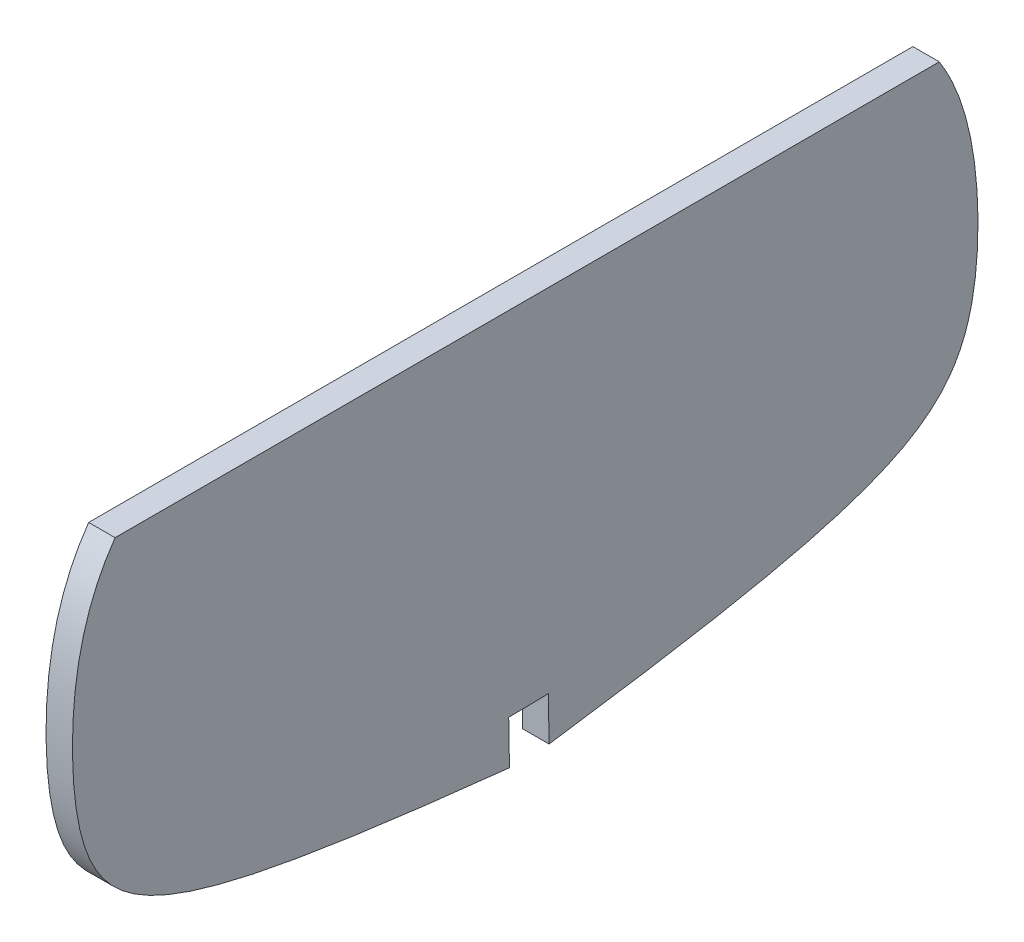
ISO-10303-21;
HEADER;
FILE_DESCRIPTION(('STEP AP214'),'2;1');
FILE_NAME('part.step','',(''),(''),'','','');
FILE_SCHEMA(('AUTOMOTIVE_DESIGN { 1 0 10303 214 1 1 1 1 }'));
ENDSEC;
DATA;
#1=APPLICATION_CONTEXT('core data for automotive mechanical design processes');
#2=APPLICATION_PROTOCOL_DEFINITION('international standard','automotive_design',2000,#1);
#3=PRODUCT_CONTEXT('',#1,'mechanical');
#4=PRODUCT('Part','Part','',(#3));
#5=PRODUCT_RELATED_PRODUCT_CATEGORY('part','',(#4));
#6=PRODUCT_DEFINITION_FORMATION('','',#4);
#7=PRODUCT_DEFINITION_CONTEXT('part definition',#1,'design');
#8=PRODUCT_DEFINITION('design','',#6,#7);
#9=PRODUCT_DEFINITION_SHAPE('','',#8);
#10=(LENGTH_UNIT() NAMED_UNIT(*) SI_UNIT(.MILLI.,.METRE.));
#11=(NAMED_UNIT(*) PLANE_ANGLE_UNIT() SI_UNIT($,.RADIAN.));
#12=(NAMED_UNIT(*) SI_UNIT($,.STERADIAN.) SOLID_ANGLE_UNIT());
#13=UNCERTAINTY_MEASURE_WITH_UNIT(LENGTH_MEASURE(1.E-05),#10,'distance_accuracy_value','');
#14=(GEOMETRIC_REPRESENTATION_CONTEXT(3) GLOBAL_UNCERTAINTY_ASSIGNED_CONTEXT((#13)) GLOBAL_UNIT_ASSIGNED_CONTEXT((#10,
#11,#12)) REPRESENTATION_CONTEXT('',''));
#15=CARTESIAN_POINT('',(0.,0.,0.));
#16=DIRECTION('',(0.,0.,1.));
#17=DIRECTION('',(1.,0.,0.));
#18=AXIS2_PLACEMENT_3D('',#15,#16,#17);
#19=CARTESIAN_POINT('',(6.,289.002460422602,4.98309979340308));
#20=CARTESIAN_POINT('',(6.,312.815060008237,-165.372196707226));
#21=CARTESIAN_POINT('',(6.,313.398260751005,-37.5129726486712));
#22=CARTESIAN_POINT('',(6.,409.320091083024,-169.034448931547));
#23=CARTESIAN_POINT('',(6.,409.751237326818,7.06510007937025));
#24=B_SPLINE_CURVE_WITH_KNOTS('',4,(#19,#20,#21,#22,#23),.UNSPECIFIED.,.F.,.F.,(5,5),(0.,1.),.UNSPECIFIED.);
#25=DIRECTION('',(-1.,0.,0.));
#26=VECTOR('',#25,1.);
#27=SURFACE_OF_LINEAR_EXTRUSION('',#24,#26);
#28=CARTESIAN_POINT('',(0.,289.002460422602,4.98309979340308));
#29=CARTESIAN_POINT('',(0.,312.815060008237,-165.372196707226));
#30=CARTESIAN_POINT('',(0.,313.398260751005,-37.5129726486712));
#31=CARTESIAN_POINT('',(0.,409.320091083024,-169.034448931547));
#32=CARTESIAN_POINT('',(0.,409.751237326818,7.06510007937025));
#33=B_SPLINE_CURVE_WITH_KNOTS('',4,(#28,#29,#30,#31,#32),.UNSPECIFIED.,.F.,.F.,(5,5),(0.,1.),.UNSPECIFIED.);
#34=CARTESIAN_POINT('',(0.,289.635171211587,0.492671400530014));
#35=VERTEX_POINT('',#34);
#36=CARTESIAN_POINT('',(0.,379.522870514622,-88.1370104605886));
#37=VERTEX_POINT('',#36);
#38=EDGE_CURVE('E114',#35,#37,#33,.T.);
#39=ORIENTED_EDGE('',*,*,#38,.T.);
#40=DIRECTION('',(-1.,0.,0.));
#41=VECTOR('',#40,1.);
#42=CARTESIAN_POINT('',(6.,379.522870513728,-88.1370104611526));
#43=LINE('',#42,#41);
#44=CARTESIAN_POINT('',(6.,379.522870513728,-88.1370104605886));
#45=VERTEX_POINT('',#44);
#46=EDGE_CURVE('E48',#37,#45,#43,.F.);
#47=ORIENTED_EDGE('',*,*,#46,.T.);
#48=CARTESIAN_POINT('',(6.,289.635171211587,0.492671400530014));
#49=VERTEX_POINT('',#48);
#50=EDGE_CURVE('E98',#49,#45,#24,.T.);
#51=ORIENTED_EDGE('',*,*,#50,.F.);
#52=DIRECTION('',(1.,0.,0.));
#53=VECTOR('',#52,1.);
#54=CARTESIAN_POINT('',(0.,289.635171211587,0.492671400530014));
#55=LINE('',#54,#53);
#56=EDGE_CURVE('E149',#35,#49,#55,.T.);
#57=ORIENTED_EDGE('',*,*,#56,.F.);
#58=EDGE_LOOP('',(#39,#47,#51,#57));
#59=FACE_BOUND('',#58,.T.);
#60=ADVANCED_FACE('F33',(#59),#27,.F.);
#61=CARTESIAN_POINT('',(6.,409.751237326818,7.06510007937025));
#62=CARTESIAN_POINT('',(6.,403.249389945732,183.045107550575));
#63=CARTESIAN_POINT('',(6.,311.918725168243,48.2949464034591));
#64=CARTESIAN_POINT('',(6.,306.92797845909,176.058062157761));
#65=CARTESIAN_POINT('',(6.,289.002460422602,4.98309979340308));
#66=B_SPLINE_CURVE_WITH_KNOTS('',4,(#61,#62,#63,#64,#65),.UNSPECIFIED.,.F.,.F.,(5,5),(0.,1.),.UNSPECIFIED.);
#67=DIRECTION('',(-1.,0.,0.));
#68=VECTOR('',#67,1.);
#69=SURFACE_OF_LINEAR_EXTRUSION('',#66,#68);
#70=CARTESIAN_POINT('',(6.,379.522870513728,99.0686347015067));
#71=VERTEX_POINT('',#70);
#72=CARTESIAN_POINT('',(6.,289.479989494189,9.49267140053002));
#73=VERTEX_POINT('',#72);
#74=EDGE_CURVE('E41',#71,#73,#66,.T.);
#75=ORIENTED_EDGE('',*,*,#74,.F.);
#76=DIRECTION('',(-1.,0.,0.));
#77=VECTOR('',#76,1.);
#78=CARTESIAN_POINT('',(6.,379.522870513728,99.0686347017889));
#79=LINE('',#78,#77);
#80=CARTESIAN_POINT('',(0.,379.522870513728,99.0686347015067));
#81=VERTEX_POINT('',#80);
#82=EDGE_CURVE('E83',#71,#81,#79,.T.);
#83=ORIENTED_EDGE('',*,*,#82,.T.);
#84=CARTESIAN_POINT('',(0.,409.751237326818,7.06510007937025));
#85=CARTESIAN_POINT('',(0.,403.249389945732,183.045107550575));
#86=CARTESIAN_POINT('',(0.,311.918725168243,48.2949464034591));
#87=CARTESIAN_POINT('',(0.,306.92797845909,176.058062157761));
#88=CARTESIAN_POINT('',(0.,289.002460422602,4.98309979340308));
#89=B_SPLINE_CURVE_WITH_KNOTS('',4,(#84,#85,#86,#87,#88),.UNSPECIFIED.,.F.,.F.,(5,5),(0.,1.),.UNSPECIFIED.);
#90=CARTESIAN_POINT('',(0.,289.479989494189,9.49267140053002));
#91=VERTEX_POINT('',#90);
#92=EDGE_CURVE('E105',#81,#91,#89,.T.);
#93=ORIENTED_EDGE('',*,*,#92,.T.);
#94=DIRECTION('',(1.,0.,0.));
#95=VECTOR('',#94,1.);
#96=CARTESIAN_POINT('',(0.,289.479989494189,9.49267140053002));
#97=LINE('',#96,#95);
#98=EDGE_CURVE('E103',#91,#73,#97,.T.);
#99=ORIENTED_EDGE('',*,*,#98,.T.);
#100=EDGE_LOOP('',(#75,#83,#93,#99));
#101=FACE_BOUND('',#100,.T.);
#102=ADVANCED_FACE('F101',(#101),#69,.F.);
#103=CARTESIAN_POINT('',(6.,341.730241663781,-96.9160136608967));
#104=DIRECTION('',(1.,0.,0.));
#105=DIRECTION('',(0.,0.,-1.));
#106=AXIS2_PLACEMENT_3D('',#103,#104,#105);
#107=PLANE('',#106);
#108=DIRECTION('',(0.,0.,-1.));
#109=VECTOR('',#108,1.);
#110=CARTESIAN_POINT('',(6.,379.522870513728,108.247582595054));
#111=LINE('',#110,#109);
#112=EDGE_CURVE('E86',#71,#45,#111,.T.);
#113=ORIENTED_EDGE('',*,*,#112,.F.);
#114=ORIENTED_EDGE('',*,*,#74,.T.);
#115=DIRECTION('',(0.,-0.99985138273341,-0.017239850523927));
#116=VECTOR('',#115,1.);
#117=CARTESIAN_POINT('',(6.,289.479989494189,9.49267140053002));
#118=LINE('',#117,#116);
#119=CARTESIAN_POINT('',(6.,299.479989494189,9.66509553097225));
#120=VERTEX_POINT('',#119);
#121=EDGE_CURVE('E156',#120,#73,#118,.T.);
#122=ORIENTED_EDGE('',*,*,#121,.F.);
#123=DIRECTION('',(0.,-0.0172398505239238,0.99985138273341));
#124=VECTOR('',#123,1.);
#125=CARTESIAN_POINT('',(6.,299.479989494189,9.66509553097225));
#126=LINE('',#125,#124);
#127=CARTESIAN_POINT('',(6.,299.635171211587,0.665095530972245));
#128=VERTEX_POINT('',#127);
#129=EDGE_CURVE('E169',#128,#120,#126,.T.);
#130=ORIENTED_EDGE('',*,*,#129,.F.);
#131=DIRECTION('',(0.,0.99985138273341,0.0172398505239271));
#132=VECTOR('',#131,1.);
#133=CARTESIAN_POINT('',(6.,299.635171211587,0.665095530972245));
#134=LINE('',#133,#132);
#135=EDGE_CURVE('E168',#49,#128,#134,.T.);
#136=ORIENTED_EDGE('',*,*,#135,.F.);
#137=ORIENTED_EDGE('',*,*,#50,.T.);
#138=EDGE_LOOP('',(#113,#114,#122,#130,#136,#137));
#139=FACE_BOUND('',#138,.T.);
#140=ADVANCED_FACE('F93',(#139),#107,.T.);
#141=CARTESIAN_POINT('',(0.,341.730241663781,-96.9160136608967));
#142=DIRECTION('',(1.,0.,0.));
#143=DIRECTION('',(0.,0.,-1.));
#144=AXIS2_PLACEMENT_3D('',#141,#142,#143);
#145=PLANE('',#144);
#146=ORIENTED_EDGE('',*,*,#92,.F.);
#147=DIRECTION('',(0.,0.,-1.));
#148=VECTOR('',#147,1.);
#149=CARTESIAN_POINT('',(0.,379.522870513728,-96.9160136608967));
#150=LINE('',#149,#148);
#151=EDGE_CURVE('E11',#81,#37,#150,.T.);
#152=ORIENTED_EDGE('',*,*,#151,.T.);
#153=ORIENTED_EDGE('',*,*,#38,.F.);
#154=DIRECTION('',(0.,0.99985138273341,0.0172398505239271));
#155=VECTOR('',#154,1.);
#156=CARTESIAN_POINT('',(0.,299.635171211587,0.665095530972245));
#157=LINE('',#156,#155);
#158=CARTESIAN_POINT('',(0.,299.635171211587,0.665095530972241));
#159=VERTEX_POINT('',#158);
#160=EDGE_CURVE('E164',#35,#159,#157,.T.);
#161=ORIENTED_EDGE('',*,*,#160,.T.);
#162=DIRECTION('',(0.,-0.0172398505239238,0.99985138273341));
#163=VECTOR('',#162,1.);
#164=CARTESIAN_POINT('',(0.,299.479989494189,9.66509553097225));
#165=LINE('',#164,#163);
#166=CARTESIAN_POINT('',(0.,299.479989494189,9.66509553097225));
#167=VERTEX_POINT('',#166);
#168=EDGE_CURVE('E55',#159,#167,#165,.T.);
#169=ORIENTED_EDGE('',*,*,#168,.T.);
#170=DIRECTION('',(0.,-0.99985138273341,-0.017239850523927));
#171=VECTOR('',#170,1.);
#172=CARTESIAN_POINT('',(0.,289.479989494189,9.49267140053002));
#173=LINE('',#172,#171);
#174=EDGE_CURVE('E159',#167,#91,#173,.T.);
#175=ORIENTED_EDGE('',*,*,#174,.T.);
#176=EDGE_LOOP('',(#146,#152,#153,#161,#169,#175));
#177=FACE_BOUND('',#176,.T.);
#178=ADVANCED_FACE('F122',(#177),#145,.F.);
#179=CARTESIAN_POINT('',(0.,289.479989494189,9.49267140053002));
#180=DIRECTION('',(0.,-0.017239850523927,0.99985138273341));
#181=DIRECTION('',(0.,-0.99985138273341,-0.017239850523927));
#182=AXIS2_PLACEMENT_3D('',#179,#180,#181);
#183=PLANE('',#182);
#184=ORIENTED_EDGE('',*,*,#121,.T.);
#185=ORIENTED_EDGE('',*,*,#98,.F.);
#186=ORIENTED_EDGE('',*,*,#174,.F.);
#187=DIRECTION('',(1.,0.,0.));
#188=VECTOR('',#187,1.);
#189=CARTESIAN_POINT('',(0.,299.479989494189,9.66509553097225));
#190=LINE('',#189,#188);
#191=EDGE_CURVE('E151',#167,#120,#190,.T.);
#192=ORIENTED_EDGE('',*,*,#191,.T.);
#193=EDGE_LOOP('',(#184,#185,#186,#192));
#194=FACE_BOUND('',#193,.T.);
#195=ADVANCED_FACE('F125',(#194),#183,.F.);
#196=CARTESIAN_POINT('',(0.,299.479989494189,9.66509553097225));
#197=DIRECTION('',(0.,0.99985138273341,0.0172398505239238));
#198=DIRECTION('',(0.,-0.0172398505239238,0.999851382733411));
#199=AXIS2_PLACEMENT_3D('',#196,#197,#198);
#200=PLANE('',#199);
#201=ORIENTED_EDGE('',*,*,#129,.T.);
#202=ORIENTED_EDGE('',*,*,#191,.F.);
#203=ORIENTED_EDGE('',*,*,#168,.F.);
#204=DIRECTION('',(1.,0.,0.));
#205=VECTOR('',#204,1.);
#206=CARTESIAN_POINT('',(0.,299.635171211587,0.665095530972245));
#207=LINE('',#206,#205);
#208=EDGE_CURVE('E153',#159,#128,#207,.T.);
#209=ORIENTED_EDGE('',*,*,#208,.T.);
#210=EDGE_LOOP('',(#201,#202,#203,#209));
#211=FACE_BOUND('',#210,.T.);
#212=ADVANCED_FACE('F132',(#211),#200,.F.);
#213=CARTESIAN_POINT('',(0.,299.635171211587,0.665095530972245));
#214=DIRECTION('',(0.,0.0172398505239271,-0.99985138273341));
#215=DIRECTION('',(0.,0.99985138273341,0.0172398505239271));
#216=AXIS2_PLACEMENT_3D('',#213,#214,#215);
#217=PLANE('',#216);
#218=ORIENTED_EDGE('',*,*,#135,.T.);
#219=ORIENTED_EDGE('',*,*,#208,.F.);
#220=ORIENTED_EDGE('',*,*,#160,.F.);
#221=ORIENTED_EDGE('',*,*,#56,.T.);
#222=EDGE_LOOP('',(#218,#219,#220,#221));
#223=FACE_BOUND('',#222,.T.);
#224=ADVANCED_FACE('F129',(#223),#217,.F.);
#225=CARTESIAN_POINT('',(0.,379.522870513728,108.247582595054));
#226=DIRECTION('',(0.,-1.,0.));
#227=DIRECTION('',(0.,0.,-1.));
#228=AXIS2_PLACEMENT_3D('',#225,#226,#227);
#229=PLANE('',#228);
#230=ORIENTED_EDGE('',*,*,#151,.F.);
#231=ORIENTED_EDGE('',*,*,#82,.F.);
#232=ORIENTED_EDGE('',*,*,#112,.T.);
#233=ORIENTED_EDGE('',*,*,#46,.F.);
#234=EDGE_LOOP('',(#230,#231,#232,#233));
#235=FACE_BOUND('',#234,.T.);
#236=ADVANCED_FACE('F85',(#235),#229,.F.);
#237=CLOSED_SHELL('',(#60,#102,#140,#178,#195,#212,#224,#236));
#238=MANIFOLD_SOLID_BREP('B2',#237);
#239=ADVANCED_BREP_SHAPE_REPRESENTATION('',(#18,#238),#14);
#240=SHAPE_DEFINITION_REPRESENTATION(#9,#239);
ENDSEC;
END-ISO-10303-21;
